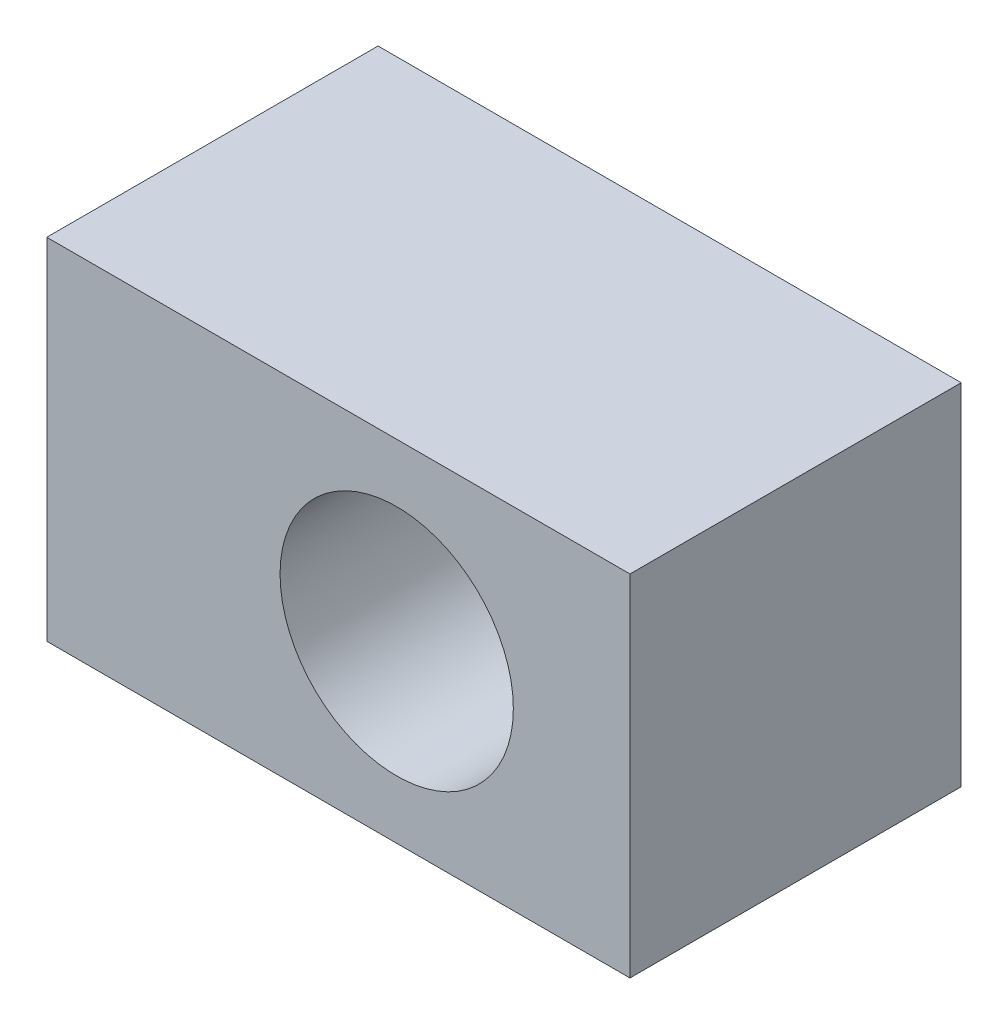
ISO-10303-21;
HEADER;
FILE_DESCRIPTION(('STEP AP214'),'2;1');
FILE_NAME('part.step','',(''),(''),'','','');
FILE_SCHEMA(('AUTOMOTIVE_DESIGN { 1 0 10303 214 1 1 1 1 }'));
ENDSEC;
DATA;
#1=APPLICATION_CONTEXT('core data for automotive mechanical design processes');
#2=APPLICATION_PROTOCOL_DEFINITION('international standard','automotive_design',2000,#1);
#3=PRODUCT_CONTEXT('',#1,'mechanical');
#4=PRODUCT('Part','Part','',(#3));
#5=PRODUCT_RELATED_PRODUCT_CATEGORY('part','',(#4));
#6=PRODUCT_DEFINITION_FORMATION('','',#4);
#7=PRODUCT_DEFINITION_CONTEXT('part definition',#1,'design');
#8=PRODUCT_DEFINITION('design','',#6,#7);
#9=PRODUCT_DEFINITION_SHAPE('','',#8);
#10=(LENGTH_UNIT() NAMED_UNIT(*) SI_UNIT(.MILLI.,.METRE.));
#11=(NAMED_UNIT(*) PLANE_ANGLE_UNIT() SI_UNIT($,.RADIAN.));
#12=(NAMED_UNIT(*) SI_UNIT($,.STERADIAN.) SOLID_ANGLE_UNIT());
#13=UNCERTAINTY_MEASURE_WITH_UNIT(LENGTH_MEASURE(1.E-05),#10,'distance_accuracy_value','');
#14=(GEOMETRIC_REPRESENTATION_CONTEXT(3) GLOBAL_UNCERTAINTY_ASSIGNED_CONTEXT((#13)) GLOBAL_UNIT_ASSIGNED_CONTEXT((#10,
#11,#12)) REPRESENTATION_CONTEXT('',''));
#15=CARTESIAN_POINT('',(0.,0.,0.));
#16=DIRECTION('',(0.,0.,1.));
#17=DIRECTION('',(1.,0.,0.));
#18=AXIS2_PLACEMENT_3D('',#15,#16,#17);
#19=CARTESIAN_POINT('',(0.,76.2,72.136));
#20=DIRECTION('',(1.,0.,0.));
#21=DIRECTION('',(0.,1.,0.));
#22=AXIS2_PLACEMENT_3D('',#19,#20,#21);
#23=PLANE('',#22);
#24=DIRECTION('',(0.,-1.,0.));
#25=VECTOR('',#24,1.);
#26=CARTESIAN_POINT('',(0.,76.2,0.));
#27=LINE('',#26,#25);
#28=CARTESIAN_POINT('',(0.,76.2,0.));
#29=VERTEX_POINT('',#28);
#30=CARTESIAN_POINT('',(0.,0.,0.));
#31=VERTEX_POINT('',#30);
#32=EDGE_CURVE('E100',#29,#31,#27,.T.);
#33=ORIENTED_EDGE('',*,*,#32,.T.);
#34=DIRECTION('',(0.,0.,-1.));
#35=VECTOR('',#34,1.);
#36=CARTESIAN_POINT('',(0.,0.,72.136));
#37=LINE('',#36,#35);
#38=CARTESIAN_POINT('',(0.,0.,72.136));
#39=VERTEX_POINT('',#38);
#40=EDGE_CURVE('E11',#39,#31,#37,.T.);
#41=ORIENTED_EDGE('',*,*,#40,.F.);
#42=DIRECTION('',(0.,-1.,0.));
#43=VECTOR('',#42,1.);
#44=CARTESIAN_POINT('',(0.,76.2,72.136));
#45=LINE('',#44,#43);
#46=CARTESIAN_POINT('',(0.,76.2,72.136));
#47=VERTEX_POINT('',#46);
#48=EDGE_CURVE('E88',#47,#39,#45,.T.);
#49=ORIENTED_EDGE('',*,*,#48,.F.);
#50=DIRECTION('',(0.,0.,-1.));
#51=VECTOR('',#50,1.);
#52=CARTESIAN_POINT('',(0.,76.2,72.136));
#53=LINE('',#52,#51);
#54=EDGE_CURVE('E96',#47,#29,#53,.T.);
#55=ORIENTED_EDGE('',*,*,#54,.T.);
#56=EDGE_LOOP('',(#33,#41,#49,#55));
#57=FACE_BOUND('',#56,.T.);
#58=ADVANCED_FACE('F37',(#57),#23,.F.);
#59=CARTESIAN_POINT('',(0.,0.,72.136));
#60=DIRECTION('',(0.,1.,0.));
#61=DIRECTION('',(0.,0.,1.));
#62=AXIS2_PLACEMENT_3D('',#59,#60,#61);
#63=PLANE('',#62);
#64=DIRECTION('',(1.,0.,0.));
#65=VECTOR('',#64,1.);
#66=CARTESIAN_POINT('',(0.,0.,0.));
#67=LINE('',#66,#65);
#68=CARTESIAN_POINT('',(127.,0.,0.));
#69=VERTEX_POINT('',#68);
#70=EDGE_CURVE('E92',#31,#69,#67,.T.);
#71=ORIENTED_EDGE('',*,*,#70,.T.);
#72=DIRECTION('',(0.,0.,-1.));
#73=VECTOR('',#72,1.);
#74=CARTESIAN_POINT('',(127.,0.,72.136));
#75=LINE('',#74,#73);
#76=CARTESIAN_POINT('',(127.,0.,72.136));
#77=VERTEX_POINT('',#76);
#78=EDGE_CURVE('E45',#77,#69,#75,.T.);
#79=ORIENTED_EDGE('',*,*,#78,.F.);
#80=DIRECTION('',(1.,0.,0.));
#81=VECTOR('',#80,1.);
#82=CARTESIAN_POINT('',(0.,0.,72.136));
#83=LINE('',#82,#81);
#84=EDGE_CURVE('E83',#39,#77,#83,.T.);
#85=ORIENTED_EDGE('',*,*,#84,.F.);
#86=ORIENTED_EDGE('',*,*,#40,.T.);
#87=EDGE_LOOP('',(#71,#79,#85,#86));
#88=FACE_BOUND('',#87,.T.);
#89=ADVANCED_FACE('F91',(#88),#63,.F.);
#90=CARTESIAN_POINT('',(127.,76.2,72.136));
#91=DIRECTION('',(-1.,0.,0.));
#92=DIRECTION('',(0.,0.,1.));
#93=AXIS2_PLACEMENT_3D('',#90,#91,#92);
#94=PLANE('',#93);
#95=DIRECTION('',(0.,1.,0.));
#96=VECTOR('',#95,1.);
#97=CARTESIAN_POINT('',(127.,76.2,0.));
#98=LINE('',#97,#96);
#99=CARTESIAN_POINT('',(127.,76.2,0.));
#100=VERTEX_POINT('',#99);
#101=EDGE_CURVE('E70',#69,#100,#98,.T.);
#102=ORIENTED_EDGE('',*,*,#101,.T.);
#103=DIRECTION('',(0.,0.,-1.));
#104=VECTOR('',#103,1.);
#105=CARTESIAN_POINT('',(127.,76.2,72.136));
#106=LINE('',#105,#104);
#107=CARTESIAN_POINT('',(127.,76.2,72.136));
#108=VERTEX_POINT('',#107);
#109=EDGE_CURVE('E93',#108,#100,#106,.T.);
#110=ORIENTED_EDGE('',*,*,#109,.F.);
#111=DIRECTION('',(0.,1.,0.));
#112=VECTOR('',#111,1.);
#113=CARTESIAN_POINT('',(127.,76.2,72.136));
#114=LINE('',#113,#112);
#115=EDGE_CURVE('E86',#77,#108,#114,.T.);
#116=ORIENTED_EDGE('',*,*,#115,.F.);
#117=ORIENTED_EDGE('',*,*,#78,.T.);
#118=EDGE_LOOP('',(#102,#110,#116,#117));
#119=FACE_BOUND('',#118,.T.);
#120=ADVANCED_FACE('F94',(#119),#94,.F.);
#121=CARTESIAN_POINT('',(0.,76.2,72.136));
#122=DIRECTION('',(0.,-1.,0.));
#123=DIRECTION('',(0.,0.,-1.));
#124=AXIS2_PLACEMENT_3D('',#121,#122,#123);
#125=PLANE('',#124);
#126=DIRECTION('',(-1.,0.,0.));
#127=VECTOR('',#126,1.);
#128=CARTESIAN_POINT('',(0.,76.2,0.));
#129=LINE('',#128,#127);
#130=EDGE_CURVE('E76',#100,#29,#129,.T.);
#131=ORIENTED_EDGE('',*,*,#130,.T.);
#132=ORIENTED_EDGE('',*,*,#54,.F.);
#133=DIRECTION('',(-1.,0.,0.));
#134=VECTOR('',#133,1.);
#135=CARTESIAN_POINT('',(0.,76.2,72.136));
#136=LINE('',#135,#134);
#137=EDGE_CURVE('E53',#108,#47,#136,.T.);
#138=ORIENTED_EDGE('',*,*,#137,.F.);
#139=ORIENTED_EDGE('',*,*,#109,.T.);
#140=EDGE_LOOP('',(#131,#132,#138,#139));
#141=FACE_BOUND('',#140,.T.);
#142=ADVANCED_FACE('F108',(#141),#125,.F.);
#143=CARTESIAN_POINT('',(0.,0.,72.136));
#144=DIRECTION('',(0.,0.,1.));
#145=DIRECTION('',(1.,0.,0.));
#146=AXIS2_PLACEMENT_3D('',#143,#144,#145);
#147=PLANE('',#146);
#148=CARTESIAN_POINT('',(76.2,38.1,72.136));
#149=DIRECTION('',(0.,0.,1.));
#150=DIRECTION('',(1.,0.,0.));
#151=AXIS2_PLACEMENT_3D('',#148,#149,#150);
#152=CIRCLE('',#151,25.4);
#153=CARTESIAN_POINT('',(101.6,38.1,72.136));
#154=VERTEX_POINT('',#153);
#155=EDGE_CURVE('E114',#154,#154,#152,.T.);
#156=ORIENTED_EDGE('',*,*,#155,.F.);
#157=EDGE_LOOP('',(#156));
#158=FACE_BOUND('',#157,.T.);
#159=ORIENTED_EDGE('',*,*,#48,.T.);
#160=ORIENTED_EDGE('',*,*,#84,.T.);
#161=ORIENTED_EDGE('',*,*,#115,.T.);
#162=ORIENTED_EDGE('',*,*,#137,.T.);
#163=EDGE_LOOP('',(#159,#160,#161,#162));
#164=FACE_BOUND('',#163,.T.);
#165=ADVANCED_FACE('F84',(#158,#164),#147,.T.);
#166=CARTESIAN_POINT('',(0.,0.,0.));
#167=DIRECTION('',(0.,0.,1.));
#168=DIRECTION('',(1.,0.,0.));
#169=AXIS2_PLACEMENT_3D('',#166,#167,#168);
#170=PLANE('',#169);
#171=CARTESIAN_POINT('',(76.2,38.1,0.));
#172=DIRECTION('',(0.,0.,1.));
#173=DIRECTION('',(1.,0.,0.));
#174=AXIS2_PLACEMENT_3D('',#171,#172,#173);
#175=CIRCLE('',#174,25.4);
#176=CARTESIAN_POINT('',(101.6,38.1,0.));
#177=VERTEX_POINT('',#176);
#178=EDGE_CURVE('E103',#177,#177,#175,.T.);
#179=ORIENTED_EDGE('',*,*,#178,.T.);
#180=EDGE_LOOP('',(#179));
#181=FACE_BOUND('',#180,.T.);
#182=ORIENTED_EDGE('',*,*,#32,.F.);
#183=ORIENTED_EDGE('',*,*,#130,.F.);
#184=ORIENTED_EDGE('',*,*,#101,.F.);
#185=ORIENTED_EDGE('',*,*,#70,.F.);
#186=EDGE_LOOP('',(#182,#183,#184,#185));
#187=FACE_BOUND('',#186,.T.);
#188=ADVANCED_FACE('F111',(#181,#187),#170,.F.);
#189=CARTESIAN_POINT('',(76.2,38.1,0.));
#190=DIRECTION('',(0.,0.,1.));
#191=DIRECTION('',(1.,0.,0.));
#192=AXIS2_PLACEMENT_3D('',#189,#190,#191);
#193=CYLINDRICAL_SURFACE('',#192,25.4);
#194=ORIENTED_EDGE('',*,*,#178,.F.);
#195=EDGE_LOOP('',(#194));
#196=FACE_BOUND('',#195,.T.);
#197=ORIENTED_EDGE('',*,*,#155,.T.);
#198=EDGE_LOOP('',(#197));
#199=FACE_BOUND('',#198,.T.);
#200=ADVANCED_FACE('F121',(#196,#199),#193,.F.);
#201=CLOSED_SHELL('',(#58,#89,#120,#142,#165,#188,#200));
#202=MANIFOLD_SOLID_BREP('B2',#201);
#203=ADVANCED_BREP_SHAPE_REPRESENTATION('',(#18,#202),#14);
#204=SHAPE_DEFINITION_REPRESENTATION(#9,#203);
ENDSEC;
END-ISO-10303-21;
